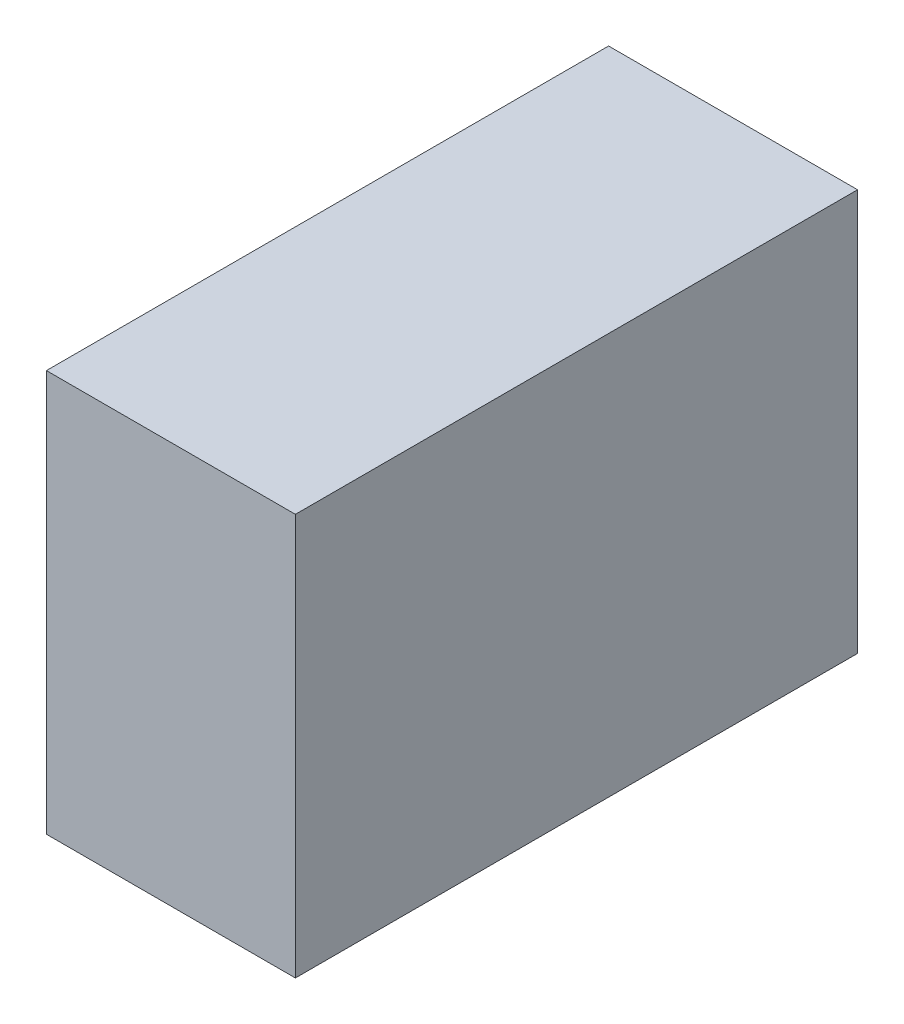
ISO-10303-21;
HEADER;
FILE_DESCRIPTION(('STEP AP214'),'2;1');
FILE_NAME('part.step','',(''),(''),'','','');
FILE_SCHEMA(('AUTOMOTIVE_DESIGN { 1 0 10303 214 1 1 1 1 }'));
ENDSEC;
DATA;
#1=APPLICATION_CONTEXT('core data for automotive mechanical design processes');
#2=APPLICATION_PROTOCOL_DEFINITION('international standard','automotive_design',2000,#1);
#3=PRODUCT_CONTEXT('',#1,'mechanical');
#4=PRODUCT('Part','Part','',(#3));
#5=PRODUCT_RELATED_PRODUCT_CATEGORY('part','',(#4));
#6=PRODUCT_DEFINITION_FORMATION('','',#4);
#7=PRODUCT_DEFINITION_CONTEXT('part definition',#1,'design');
#8=PRODUCT_DEFINITION('design','',#6,#7);
#9=PRODUCT_DEFINITION_SHAPE('','',#8);
#10=(LENGTH_UNIT() NAMED_UNIT(*) SI_UNIT(.MILLI.,.METRE.));
#11=(NAMED_UNIT(*) PLANE_ANGLE_UNIT() SI_UNIT($,.RADIAN.));
#12=(NAMED_UNIT(*) SI_UNIT($,.STERADIAN.) SOLID_ANGLE_UNIT());
#13=UNCERTAINTY_MEASURE_WITH_UNIT(LENGTH_MEASURE(1.E-05),#10,'distance_accuracy_value','');
#14=(GEOMETRIC_REPRESENTATION_CONTEXT(3) GLOBAL_UNCERTAINTY_ASSIGNED_CONTEXT((#13)) GLOBAL_UNIT_ASSIGNED_CONTEXT((#10,
#11,#12)) REPRESENTATION_CONTEXT('',''));
#15=CARTESIAN_POINT('',(0.,0.,0.));
#16=DIRECTION('',(0.,0.,1.));
#17=DIRECTION('',(1.,0.,0.));
#18=AXIS2_PLACEMENT_3D('',#15,#16,#17);
#19=CARTESIAN_POINT('',(19.685,31.75,44.45));
#20=DIRECTION('',(-1.,0.,0.));
#21=DIRECTION('',(0.,0.,1.));
#22=AXIS2_PLACEMENT_3D('',#19,#20,#21);
#23=PLANE('',#22);
#24=DIRECTION('',(0.,0.,-1.));
#25=VECTOR('',#24,1.);
#26=CARTESIAN_POINT('',(19.685,-31.75,44.45));
#27=LINE('',#26,#25);
#28=CARTESIAN_POINT('',(19.685,-31.75,44.45));
#29=VERTEX_POINT('',#28);
#30=CARTESIAN_POINT('',(19.685,-31.75,-44.45));
#31=VERTEX_POINT('',#30);
#32=EDGE_CURVE('E122',#29,#31,#27,.T.);
#33=ORIENTED_EDGE('',*,*,#32,.T.);
#34=DIRECTION('',(0.,-1.,0.));
#35=VECTOR('',#34,1.);
#36=CARTESIAN_POINT('',(19.685,31.75,-44.45));
#37=LINE('',#36,#35);
#38=CARTESIAN_POINT('',(19.685,31.75,-44.45));
#39=VERTEX_POINT('',#38);
#40=EDGE_CURVE('E12',#39,#31,#37,.T.);
#41=ORIENTED_EDGE('',*,*,#40,.F.);
#42=DIRECTION('',(0.,0.,-1.));
#43=VECTOR('',#42,1.);
#44=CARTESIAN_POINT('',(19.685,31.75,44.45));
#45=LINE('',#44,#43);
#46=CARTESIAN_POINT('',(19.685,31.75,44.45));
#47=VERTEX_POINT('',#46);
#48=EDGE_CURVE('E99',#47,#39,#45,.T.);
#49=ORIENTED_EDGE('',*,*,#48,.F.);
#50=DIRECTION('',(0.,-1.,0.));
#51=VECTOR('',#50,1.);
#52=CARTESIAN_POINT('',(19.685,31.75,44.45));
#53=LINE('',#52,#51);
#54=EDGE_CURVE('E110',#47,#29,#53,.T.);
#55=ORIENTED_EDGE('',*,*,#54,.T.);
#56=EDGE_LOOP('',(#33,#41,#49,#55));
#57=FACE_BOUND('',#56,.T.);
#58=ADVANCED_FACE('F46',(#57),#23,.F.);
#59=CARTESIAN_POINT('',(-19.685,31.75,-44.45));
#60=DIRECTION('',(0.,0.,1.));
#61=DIRECTION('',(1.,0.,0.));
#62=AXIS2_PLACEMENT_3D('',#59,#60,#61);
#63=PLANE('',#62);
#64=DIRECTION('',(-1.,0.,0.));
#65=VECTOR('',#64,1.);
#66=CARTESIAN_POINT('',(-19.685,-31.75,-44.45));
#67=LINE('',#66,#65);
#68=CARTESIAN_POINT('',(-19.685,-31.75,-44.45));
#69=VERTEX_POINT('',#68);
#70=EDGE_CURVE('E103',#31,#69,#67,.T.);
#71=ORIENTED_EDGE('',*,*,#70,.T.);
#72=DIRECTION('',(0.,-1.,0.));
#73=VECTOR('',#72,1.);
#74=CARTESIAN_POINT('',(-19.685,31.75,-44.45));
#75=LINE('',#74,#73);
#76=CARTESIAN_POINT('',(-19.685,31.75,-44.45));
#77=VERTEX_POINT('',#76);
#78=EDGE_CURVE('E54',#77,#69,#75,.T.);
#79=ORIENTED_EDGE('',*,*,#78,.F.);
#80=DIRECTION('',(-1.,0.,0.));
#81=VECTOR('',#80,1.);
#82=CARTESIAN_POINT('',(-19.685,31.75,-44.45));
#83=LINE('',#82,#81);
#84=EDGE_CURVE('E93',#39,#77,#83,.T.);
#85=ORIENTED_EDGE('',*,*,#84,.F.);
#86=ORIENTED_EDGE('',*,*,#40,.T.);
#87=EDGE_LOOP('',(#71,#79,#85,#86));
#88=FACE_BOUND('',#87,.T.);
#89=ADVANCED_FACE('F102',(#88),#63,.F.);
#90=CARTESIAN_POINT('',(-19.685,31.75,44.45));
#91=DIRECTION('',(1.,0.,0.));
#92=DIRECTION('',(0.,0.,-1.));
#93=AXIS2_PLACEMENT_3D('',#90,#91,#92);
#94=PLANE('',#93);
#95=DIRECTION('',(0.,0.,1.));
#96=VECTOR('',#95,1.);
#97=CARTESIAN_POINT('',(-19.685,-31.75,44.45));
#98=LINE('',#97,#96);
#99=CARTESIAN_POINT('',(-19.685,-31.75,44.45));
#100=VERTEX_POINT('',#99);
#101=EDGE_CURVE('E80',#69,#100,#98,.T.);
#102=ORIENTED_EDGE('',*,*,#101,.T.);
#103=DIRECTION('',(0.,-1.,0.));
#104=VECTOR('',#103,1.);
#105=CARTESIAN_POINT('',(-19.685,31.75,44.45));
#106=LINE('',#105,#104);
#107=CARTESIAN_POINT('',(-19.685,31.75,44.45));
#108=VERTEX_POINT('',#107);
#109=EDGE_CURVE('E105',#108,#100,#106,.T.);
#110=ORIENTED_EDGE('',*,*,#109,.F.);
#111=DIRECTION('',(0.,0.,1.));
#112=VECTOR('',#111,1.);
#113=CARTESIAN_POINT('',(-19.685,31.75,44.45));
#114=LINE('',#113,#112);
#115=EDGE_CURVE('E97',#77,#108,#114,.T.);
#116=ORIENTED_EDGE('',*,*,#115,.F.);
#117=ORIENTED_EDGE('',*,*,#78,.T.);
#118=EDGE_LOOP('',(#102,#110,#116,#117));
#119=FACE_BOUND('',#118,.T.);
#120=ADVANCED_FACE('F106',(#119),#94,.F.);
#121=CARTESIAN_POINT('',(-19.685,31.75,44.45));
#122=DIRECTION('',(0.,0.,-1.));
#123=DIRECTION('',(-1.,0.,0.));
#124=AXIS2_PLACEMENT_3D('',#121,#122,#123);
#125=PLANE('',#124);
#126=DIRECTION('',(1.,0.,0.));
#127=VECTOR('',#126,1.);
#128=CARTESIAN_POINT('',(-19.685,-31.75,44.45));
#129=LINE('',#128,#127);
#130=EDGE_CURVE('E86',#100,#29,#129,.T.);
#131=ORIENTED_EDGE('',*,*,#130,.T.);
#132=ORIENTED_EDGE('',*,*,#54,.F.);
#133=DIRECTION('',(1.,0.,0.));
#134=VECTOR('',#133,1.);
#135=CARTESIAN_POINT('',(-19.685,31.75,44.45));
#136=LINE('',#135,#134);
#137=EDGE_CURVE('E62',#108,#47,#136,.T.);
#138=ORIENTED_EDGE('',*,*,#137,.F.);
#139=ORIENTED_EDGE('',*,*,#109,.T.);
#140=EDGE_LOOP('',(#131,#132,#138,#139));
#141=FACE_BOUND('',#140,.T.);
#142=ADVANCED_FACE('F133',(#141),#125,.F.);
#143=CARTESIAN_POINT('',(0.,31.75,0.));
#144=DIRECTION('',(0.,-1.,0.));
#145=DIRECTION('',(0.,0.,-1.));
#146=AXIS2_PLACEMENT_3D('',#143,#144,#145);
#147=PLANE('',#146);
#148=ORIENTED_EDGE('',*,*,#48,.T.);
#149=ORIENTED_EDGE('',*,*,#84,.T.);
#150=ORIENTED_EDGE('',*,*,#115,.T.);
#151=ORIENTED_EDGE('',*,*,#137,.T.);
#152=EDGE_LOOP('',(#148,#149,#150,#151));
#153=FACE_BOUND('',#152,.T.);
#154=ADVANCED_FACE('F95',(#153),#147,.F.);
#155=CARTESIAN_POINT('',(0.,-31.75,0.));
#156=DIRECTION('',(0.,-1.,0.));
#157=DIRECTION('',(0.,0.,-1.));
#158=AXIS2_PLACEMENT_3D('',#155,#156,#157);
#159=PLANE('',#158);
#160=ORIENTED_EDGE('',*,*,#32,.F.);
#161=ORIENTED_EDGE('',*,*,#130,.F.);
#162=ORIENTED_EDGE('',*,*,#101,.F.);
#163=ORIENTED_EDGE('',*,*,#70,.F.);
#164=EDGE_LOOP('',(#160,#161,#162,#163));
#165=FACE_BOUND('',#164,.T.);
#166=ADVANCED_FACE('F127',(#165),#159,.T.);
#167=CLOSED_SHELL('',(#58,#89,#120,#142,#154,#166));
#168=MANIFOLD_SOLID_BREP('B2',#167);
#169=ADVANCED_BREP_SHAPE_REPRESENTATION('',(#18,#168),#14);
#170=SHAPE_DEFINITION_REPRESENTATION(#9,#169);
ENDSEC;
END-ISO-10303-21;
